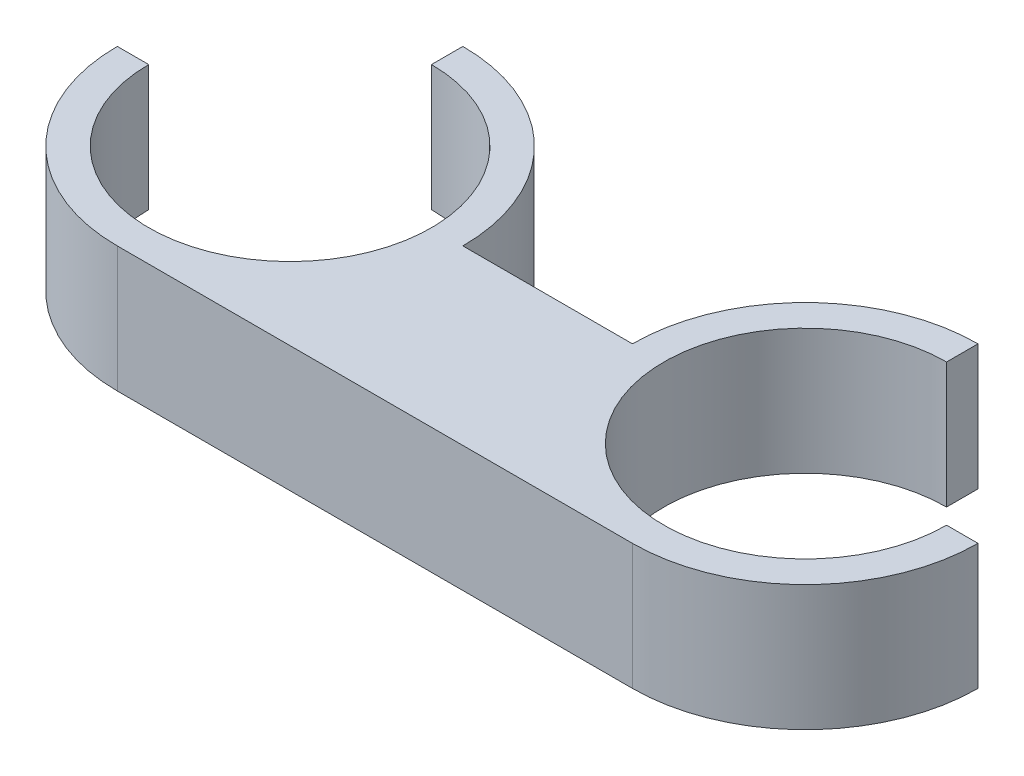
ISO-10303-21;
HEADER;
FILE_DESCRIPTION(('STEP AP214'),'2;1');
FILE_NAME('part.step','',(''),(''),'','','');
FILE_SCHEMA(('AUTOMOTIVE_DESIGN { 1 0 10303 214 1 1 1 1 }'));
ENDSEC;
DATA;
#1=APPLICATION_CONTEXT('core data for automotive mechanical design processes');
#2=APPLICATION_PROTOCOL_DEFINITION('international standard','automotive_design',2000,#1);
#3=PRODUCT_CONTEXT('',#1,'mechanical');
#4=PRODUCT('Part','Part','',(#3));
#5=PRODUCT_RELATED_PRODUCT_CATEGORY('part','',(#4));
#6=PRODUCT_DEFINITION_FORMATION('','',#4);
#7=PRODUCT_DEFINITION_CONTEXT('part definition',#1,'design');
#8=PRODUCT_DEFINITION('design','',#6,#7);
#9=PRODUCT_DEFINITION_SHAPE('','',#8);
#10=(LENGTH_UNIT() NAMED_UNIT(*) SI_UNIT(.MILLI.,.METRE.));
#11=(NAMED_UNIT(*) PLANE_ANGLE_UNIT() SI_UNIT($,.RADIAN.));
#12=(NAMED_UNIT(*) SI_UNIT($,.STERADIAN.) SOLID_ANGLE_UNIT());
#13=UNCERTAINTY_MEASURE_WITH_UNIT(LENGTH_MEASURE(1.E-05),#10,'distance_accuracy_value','');
#14=(GEOMETRIC_REPRESENTATION_CONTEXT(3) GLOBAL_UNCERTAINTY_ASSIGNED_CONTEXT((#13)) GLOBAL_UNIT_ASSIGNED_CONTEXT((#10,
#11,#12)) REPRESENTATION_CONTEXT('',''));
#15=CARTESIAN_POINT('',(0.,0.,0.));
#16=DIRECTION('',(0.,0.,1.));
#17=DIRECTION('',(1.,0.,0.));
#18=AXIS2_PLACEMENT_3D('',#15,#16,#17);
#19=CARTESIAN_POINT('',(-32.7952041244696,8.,0.));
#20=DIRECTION('',(0.,-1.,0.));
#21=DIRECTION('',(0.,0.,-1.));
#22=AXIS2_PLACEMENT_3D('',#19,#20,#21);
#23=CYLINDRICAL_SURFACE('',#22,11.);
#24=CARTESIAN_POINT('',(-32.7952041244696,0.,0.));
#25=DIRECTION('',(0.,1.,0.));
#26=DIRECTION('',(0.,0.,1.));
#27=AXIS2_PLACEMENT_3D('',#24,#25,#26);
#28=CIRCLE('',#27,11.);
#29=CARTESIAN_POINT('',(-43.7952041244696,0.,0.));
#30=VERTEX_POINT('',#29);
#31=CARTESIAN_POINT('',(-32.7952041244695,0.,11.));
#32=VERTEX_POINT('',#31);
#33=EDGE_CURVE('E159',#30,#32,#28,.T.);
#34=ORIENTED_EDGE('',*,*,#33,.T.);
#35=DIRECTION('',(0.,-1.,0.));
#36=VECTOR('',#35,1.);
#37=CARTESIAN_POINT('',(-32.7952041244695,8.,11.));
#38=LINE('',#37,#36);
#39=CARTESIAN_POINT('',(-32.7952041244695,8.,11.));
#40=VERTEX_POINT('',#39);
#41=EDGE_CURVE('E11',#40,#32,#38,.T.);
#42=ORIENTED_EDGE('',*,*,#41,.F.);
#43=CARTESIAN_POINT('',(-32.7952041244696,8.,0.));
#44=DIRECTION('',(0.,1.,0.));
#45=DIRECTION('',(0.,0.,1.));
#46=AXIS2_PLACEMENT_3D('',#43,#44,#45);
#47=CIRCLE('',#46,11.);
#48=CARTESIAN_POINT('',(-43.7952041244696,8.,0.));
#49=VERTEX_POINT('',#48);
#50=EDGE_CURVE('E185',#49,#40,#47,.T.);
#51=ORIENTED_EDGE('',*,*,#50,.F.);
#52=DIRECTION('',(0.,-1.,0.));
#53=VECTOR('',#52,1.);
#54=CARTESIAN_POINT('',(-43.7952041244696,8.,0.));
#55=LINE('',#54,#53);
#56=EDGE_CURVE('E155',#49,#30,#55,.T.);
#57=ORIENTED_EDGE('',*,*,#56,.T.);
#58=EDGE_LOOP('',(#34,#42,#51,#57));
#59=FACE_BOUND('',#58,.T.);
#60=ADVANCED_FACE('F39',(#59),#23,.T.);
#61=CARTESIAN_POINT('',(0.,8.,11.));
#62=DIRECTION('',(0.,0.,-1.));
#63=DIRECTION('',(-1.,0.,0.));
#64=AXIS2_PLACEMENT_3D('',#61,#62,#63);
#65=PLANE('',#64);
#66=DIRECTION('',(1.,0.,0.));
#67=VECTOR('',#66,1.);
#68=CARTESIAN_POINT('',(0.,0.,11.));
#69=LINE('',#68,#67);
#70=CARTESIAN_POINT('',(0.,0.,11.));
#71=VERTEX_POINT('',#70);
#72=EDGE_CURVE('E162',#32,#71,#69,.T.);
#73=ORIENTED_EDGE('',*,*,#72,.T.);
#74=DIRECTION('',(0.,-1.,0.));
#75=VECTOR('',#74,1.);
#76=CARTESIAN_POINT('',(0.,8.,11.));
#77=LINE('',#76,#75);
#78=CARTESIAN_POINT('',(0.,8.,11.));
#79=VERTEX_POINT('',#78);
#80=EDGE_CURVE('E48',#79,#71,#77,.T.);
#81=ORIENTED_EDGE('',*,*,#80,.F.);
#82=DIRECTION('',(1.,0.,0.));
#83=VECTOR('',#82,1.);
#84=CARTESIAN_POINT('',(0.,8.,11.));
#85=LINE('',#84,#83);
#86=EDGE_CURVE('E107',#40,#79,#85,.T.);
#87=ORIENTED_EDGE('',*,*,#86,.F.);
#88=ORIENTED_EDGE('',*,*,#41,.T.);
#89=EDGE_LOOP('',(#73,#81,#87,#88));
#90=FACE_BOUND('',#89,.T.);
#91=ADVANCED_FACE('F41',(#90),#65,.F.);
#92=CARTESIAN_POINT('',(0.,8.,0.));
#93=DIRECTION('',(0.,-1.,0.));
#94=DIRECTION('',(0.,0.,-1.));
#95=AXIS2_PLACEMENT_3D('',#92,#93,#94);
#96=CYLINDRICAL_SURFACE('',#95,11.);
#97=CARTESIAN_POINT('',(0.,0.,0.));
#98=DIRECTION('',(0.,1.,0.));
#99=DIRECTION('',(0.,0.,1.));
#100=AXIS2_PLACEMENT_3D('',#97,#98,#99);
#101=CIRCLE('',#100,11.);
#102=CARTESIAN_POINT('',(11.,0.,0.));
#103=VERTEX_POINT('',#102);
#104=EDGE_CURVE('E166',#103,#71,#101,.F.);
#105=ORIENTED_EDGE('',*,*,#104,.F.);
#106=DIRECTION('',(0.,-1.,0.));
#107=VECTOR('',#106,1.);
#108=CARTESIAN_POINT('',(11.,8.,0.));
#109=LINE('',#108,#107);
#110=CARTESIAN_POINT('',(11.,8.,0.));
#111=VERTEX_POINT('',#110);
#112=EDGE_CURVE('E200',#111,#103,#109,.T.);
#113=ORIENTED_EDGE('',*,*,#112,.F.);
#114=CARTESIAN_POINT('',(0.,8.,0.));
#115=DIRECTION('',(0.,1.,0.));
#116=DIRECTION('',(0.,0.,1.));
#117=AXIS2_PLACEMENT_3D('',#114,#115,#116);
#118=CIRCLE('',#117,11.);
#119=EDGE_CURVE('E206',#111,#79,#118,.F.);
#120=ORIENTED_EDGE('',*,*,#119,.T.);
#121=ORIENTED_EDGE('',*,*,#80,.T.);
#122=EDGE_LOOP('',(#105,#113,#120,#121));
#123=FACE_BOUND('',#122,.T.);
#124=ADVANCED_FACE('F204',(#123),#96,.T.);
#125=CARTESIAN_POINT('',(0.,8.,0.));
#126=DIRECTION('',(0.,0.,-1.));
#127=DIRECTION('',(-1.,0.,0.));
#128=AXIS2_PLACEMENT_3D('',#125,#126,#127);
#129=PLANE('',#128);
#130=DIRECTION('',(1.,0.,0.));
#131=VECTOR('',#130,1.);
#132=CARTESIAN_POINT('',(0.,0.,0.));
#133=LINE('',#132,#131);
#134=CARTESIAN_POINT('',(9.,0.,0.));
#135=VERTEX_POINT('',#134);
#136=EDGE_CURVE('E169',#135,#103,#133,.T.);
#137=ORIENTED_EDGE('',*,*,#136,.F.);
#138=DIRECTION('',(0.,-1.,0.));
#139=VECTOR('',#138,1.);
#140=CARTESIAN_POINT('',(9.,8.,0.));
#141=LINE('',#140,#139);
#142=CARTESIAN_POINT('',(9.,8.,0.));
#143=VERTEX_POINT('',#142);
#144=EDGE_CURVE('E198',#143,#135,#141,.T.);
#145=ORIENTED_EDGE('',*,*,#144,.F.);
#146=DIRECTION('',(1.,0.,0.));
#147=VECTOR('',#146,1.);
#148=CARTESIAN_POINT('',(0.,8.,0.));
#149=LINE('',#148,#147);
#150=EDGE_CURVE('E218',#143,#111,#149,.T.);
#151=ORIENTED_EDGE('',*,*,#150,.T.);
#152=ORIENTED_EDGE('',*,*,#112,.T.);
#153=EDGE_LOOP('',(#137,#145,#151,#152));
#154=FACE_BOUND('',#153,.T.);
#155=ADVANCED_FACE('F214',(#154),#129,.T.);
#156=CARTESIAN_POINT('',(0.,8.,0.));
#157=DIRECTION('',(0.,-1.,0.));
#158=DIRECTION('',(0.,0.,-1.));
#159=AXIS2_PLACEMENT_3D('',#156,#157,#158);
#160=CYLINDRICAL_SURFACE('',#159,9.);
#161=CARTESIAN_POINT('',(0.,0.,0.));
#162=DIRECTION('',(0.,1.,0.));
#163=DIRECTION('',(0.,0.,1.));
#164=AXIS2_PLACEMENT_3D('',#161,#162,#163);
#165=CIRCLE('',#164,9.);
#166=CARTESIAN_POINT('',(0.,0.,-9.));
#167=VERTEX_POINT('',#166);
#168=EDGE_CURVE('E173',#135,#167,#165,.F.);
#169=ORIENTED_EDGE('',*,*,#168,.T.);
#170=DIRECTION('',(0.,-1.,0.));
#171=VECTOR('',#170,1.);
#172=CARTESIAN_POINT('',(0.,8.,-9.));
#173=LINE('',#172,#171);
#174=CARTESIAN_POINT('',(0.,8.,-9.));
#175=VERTEX_POINT('',#174);
#176=EDGE_CURVE('E196',#175,#167,#173,.T.);
#177=ORIENTED_EDGE('',*,*,#176,.F.);
#178=CARTESIAN_POINT('',(0.,8.,0.));
#179=DIRECTION('',(0.,1.,0.));
#180=DIRECTION('',(0.,0.,1.));
#181=AXIS2_PLACEMENT_3D('',#178,#179,#180);
#182=CIRCLE('',#181,9.);
#183=EDGE_CURVE('E221',#143,#175,#182,.F.);
#184=ORIENTED_EDGE('',*,*,#183,.F.);
#185=ORIENTED_EDGE('',*,*,#144,.T.);
#186=EDGE_LOOP('',(#169,#177,#184,#185));
#187=FACE_BOUND('',#186,.T.);
#188=ADVANCED_FACE('F236',(#187),#160,.F.);
#189=CARTESIAN_POINT('',(0.,8.,0.));
#190=DIRECTION('',(1.,0.,0.));
#191=DIRECTION('',(0.,0.,-1.));
#192=AXIS2_PLACEMENT_3D('',#189,#190,#191);
#193=PLANE('',#192);
#194=DIRECTION('',(0.,0.,1.));
#195=VECTOR('',#194,1.);
#196=CARTESIAN_POINT('',(0.,0.,0.));
#197=LINE('',#196,#195);
#198=CARTESIAN_POINT('',(0.,0.,-11.));
#199=VERTEX_POINT('',#198);
#200=EDGE_CURVE('E176',#199,#167,#197,.T.);
#201=ORIENTED_EDGE('',*,*,#200,.F.);
#202=DIRECTION('',(0.,-1.,0.));
#203=VECTOR('',#202,1.);
#204=CARTESIAN_POINT('',(0.,8.,-11.));
#205=LINE('',#204,#203);
#206=CARTESIAN_POINT('',(0.,8.,-11.));
#207=VERTEX_POINT('',#206);
#208=EDGE_CURVE('E194',#207,#199,#205,.T.);
#209=ORIENTED_EDGE('',*,*,#208,.F.);
#210=DIRECTION('',(0.,0.,1.));
#211=VECTOR('',#210,1.);
#212=CARTESIAN_POINT('',(0.,8.,0.));
#213=LINE('',#212,#211);
#214=EDGE_CURVE('E226',#207,#175,#213,.T.);
#215=ORIENTED_EDGE('',*,*,#214,.T.);
#216=ORIENTED_EDGE('',*,*,#176,.T.);
#217=EDGE_LOOP('',(#201,#209,#215,#216));
#218=FACE_BOUND('',#217,.T.);
#219=ADVANCED_FACE('F238',(#218),#193,.T.);
#220=CARTESIAN_POINT('',(-11.,0.,0.));
#221=VERTEX_POINT('',#220);
#222=EDGE_CURVE('E170',#221,#199,#101,.F.);
#223=ORIENTED_EDGE('',*,*,#222,.F.);
#224=DIRECTION('',(0.,-1.,0.));
#225=VECTOR('',#224,1.);
#226=CARTESIAN_POINT('',(-11.,8.,0.));
#227=LINE('',#226,#225);
#228=CARTESIAN_POINT('',(-11.,8.,0.));
#229=VERTEX_POINT('',#228);
#230=EDGE_CURVE('E192',#229,#221,#227,.T.);
#231=ORIENTED_EDGE('',*,*,#230,.F.);
#232=EDGE_CURVE('E220',#229,#207,#118,.F.);
#233=ORIENTED_EDGE('',*,*,#232,.T.);
#234=ORIENTED_EDGE('',*,*,#208,.T.);
#235=EDGE_LOOP('',(#223,#231,#233,#234));
#236=FACE_BOUND('',#235,.T.);
#237=ADVANCED_FACE('F243',(#236),#96,.T.);
#238=CARTESIAN_POINT('',(0.,8.,0.));
#239=DIRECTION('',(0.,0.,1.));
#240=DIRECTION('',(1.,0.,0.));
#241=AXIS2_PLACEMENT_3D('',#238,#239,#240);
#242=PLANE('',#241);
#243=DIRECTION('',(-1.,0.,0.));
#244=VECTOR('',#243,1.);
#245=CARTESIAN_POINT('',(0.,0.,0.));
#246=LINE('',#245,#244);
#247=CARTESIAN_POINT('',(-21.7952041244696,0.,0.));
#248=VERTEX_POINT('',#247);
#249=EDGE_CURVE('E179',#221,#248,#246,.T.);
#250=ORIENTED_EDGE('',*,*,#249,.T.);
#251=DIRECTION('',(0.,-1.,0.));
#252=VECTOR('',#251,1.);
#253=CARTESIAN_POINT('',(-21.7952041244696,8.,0.));
#254=LINE('',#253,#252);
#255=CARTESIAN_POINT('',(-21.7952041244696,8.,0.));
#256=VERTEX_POINT('',#255);
#257=EDGE_CURVE('E189',#256,#248,#254,.T.);
#258=ORIENTED_EDGE('',*,*,#257,.F.);
#259=DIRECTION('',(-1.,0.,0.));
#260=VECTOR('',#259,1.);
#261=CARTESIAN_POINT('',(0.,8.,0.));
#262=LINE('',#261,#260);
#263=EDGE_CURVE('E225',#229,#256,#262,.T.);
#264=ORIENTED_EDGE('',*,*,#263,.F.);
#265=ORIENTED_EDGE('',*,*,#230,.T.);
#266=EDGE_LOOP('',(#250,#258,#264,#265));
#267=FACE_BOUND('',#266,.T.);
#268=ADVANCED_FACE('F247',(#267),#242,.F.);
#269=CARTESIAN_POINT('',(-32.7952041244696,0.,-11.));
#270=VERTEX_POINT('',#269);
#271=EDGE_CURVE('E163',#248,#270,#28,.T.);
#272=ORIENTED_EDGE('',*,*,#271,.T.);
#273=DIRECTION('',(0.,-1.,0.));
#274=VECTOR('',#273,1.);
#275=CARTESIAN_POINT('',(-32.7952041244696,8.,-11.));
#276=LINE('',#275,#274);
#277=CARTESIAN_POINT('',(-32.7952041244696,8.,-11.));
#278=VERTEX_POINT('',#277);
#279=EDGE_CURVE('E151',#278,#270,#276,.T.);
#280=ORIENTED_EDGE('',*,*,#279,.F.);
#281=EDGE_CURVE('E138',#256,#278,#47,.T.);
#282=ORIENTED_EDGE('',*,*,#281,.F.);
#283=ORIENTED_EDGE('',*,*,#257,.T.);
#284=EDGE_LOOP('',(#272,#280,#282,#283));
#285=FACE_BOUND('',#284,.T.);
#286=ADVANCED_FACE('F249',(#285),#23,.T.);
#287=CARTESIAN_POINT('',(-32.7952041244696,8.,0.));
#288=DIRECTION('',(1.,0.,0.));
#289=DIRECTION('',(0.,0.,-1.));
#290=AXIS2_PLACEMENT_3D('',#287,#288,#289);
#291=PLANE('',#290);
#292=DIRECTION('',(0.,0.,1.));
#293=VECTOR('',#292,1.);
#294=CARTESIAN_POINT('',(-32.7952041244696,0.,0.));
#295=LINE('',#294,#293);
#296=CARTESIAN_POINT('',(-32.7952041244696,0.,-9.));
#297=VERTEX_POINT('',#296);
#298=EDGE_CURVE('E147',#270,#297,#295,.T.);
#299=ORIENTED_EDGE('',*,*,#298,.T.);
#300=DIRECTION('',(0.,-1.,0.));
#301=VECTOR('',#300,1.);
#302=CARTESIAN_POINT('',(-32.7952041244696,8.,-9.));
#303=LINE('',#302,#301);
#304=CARTESIAN_POINT('',(-32.7952041244696,8.,-9.));
#305=VERTEX_POINT('',#304);
#306=EDGE_CURVE('E144',#305,#297,#303,.T.);
#307=ORIENTED_EDGE('',*,*,#306,.F.);
#308=DIRECTION('',(0.,0.,1.));
#309=VECTOR('',#308,1.);
#310=CARTESIAN_POINT('',(-32.7952041244696,8.,0.));
#311=LINE('',#310,#309);
#312=EDGE_CURVE('E132',#278,#305,#311,.T.);
#313=ORIENTED_EDGE('',*,*,#312,.F.);
#314=ORIENTED_EDGE('',*,*,#279,.T.);
#315=EDGE_LOOP('',(#299,#307,#313,#314));
#316=FACE_BOUND('',#315,.T.);
#317=ADVANCED_FACE('F145',(#316),#291,.F.);
#318=CARTESIAN_POINT('',(-32.7952041244696,8.,0.));
#319=DIRECTION('',(0.,-1.,0.));
#320=DIRECTION('',(0.,0.,-1.));
#321=AXIS2_PLACEMENT_3D('',#318,#319,#320);
#322=CYLINDRICAL_SURFACE('',#321,9.);
#323=CARTESIAN_POINT('',(-32.7952041244696,0.,0.));
#324=DIRECTION('',(0.,1.,0.));
#325=DIRECTION('',(0.,0.,1.));
#326=AXIS2_PLACEMENT_3D('',#323,#324,#325);
#327=CIRCLE('',#326,9.);
#328=CARTESIAN_POINT('',(-41.7952041244696,0.,0.));
#329=VERTEX_POINT('',#328);
#330=EDGE_CURVE('E182',#329,#297,#327,.T.);
#331=ORIENTED_EDGE('',*,*,#330,.F.);
#332=DIRECTION('',(0.,-1.,0.));
#333=VECTOR('',#332,1.);
#334=CARTESIAN_POINT('',(-41.7952041244696,8.,0.));
#335=LINE('',#334,#333);
#336=CARTESIAN_POINT('',(-41.7952041244696,8.,0.));
#337=VERTEX_POINT('',#336);
#338=EDGE_CURVE('E96',#337,#329,#335,.T.);
#339=ORIENTED_EDGE('',*,*,#338,.F.);
#340=CARTESIAN_POINT('',(-32.7952041244696,8.,0.));
#341=DIRECTION('',(0.,1.,0.));
#342=DIRECTION('',(0.,0.,1.));
#343=AXIS2_PLACEMENT_3D('',#340,#341,#342);
#344=CIRCLE('',#343,9.);
#345=EDGE_CURVE('E136',#337,#305,#344,.T.);
#346=ORIENTED_EDGE('',*,*,#345,.T.);
#347=ORIENTED_EDGE('',*,*,#306,.T.);
#348=EDGE_LOOP('',(#331,#339,#346,#347));
#349=FACE_BOUND('',#348,.T.);
#350=ADVANCED_FACE('F153',(#349),#322,.F.);
#351=CARTESIAN_POINT('',(0.,8.,0.));
#352=DIRECTION('',(0.,0.,1.));
#353=DIRECTION('',(1.,0.,0.));
#354=AXIS2_PLACEMENT_3D('',#351,#352,#353);
#355=PLANE('',#354);
#356=DIRECTION('',(-1.,0.,0.));
#357=VECTOR('',#356,1.);
#358=CARTESIAN_POINT('',(0.,0.,0.));
#359=LINE('',#358,#357);
#360=EDGE_CURVE('E99',#329,#30,#359,.T.);
#361=ORIENTED_EDGE('',*,*,#360,.T.);
#362=ORIENTED_EDGE('',*,*,#56,.F.);
#363=DIRECTION('',(-1.,0.,0.));
#364=VECTOR('',#363,1.);
#365=CARTESIAN_POINT('',(0.,8.,0.));
#366=LINE('',#365,#364);
#367=EDGE_CURVE('E56',#337,#49,#366,.T.);
#368=ORIENTED_EDGE('',*,*,#367,.F.);
#369=ORIENTED_EDGE('',*,*,#338,.T.);
#370=EDGE_LOOP('',(#361,#362,#368,#369));
#371=FACE_BOUND('',#370,.T.);
#372=ADVANCED_FACE('F253',(#371),#355,.F.);
#373=CARTESIAN_POINT('',(0.,8.,0.));
#374=DIRECTION('',(0.,1.,0.));
#375=DIRECTION('',(0.,0.,1.));
#376=AXIS2_PLACEMENT_3D('',#373,#374,#375);
#377=PLANE('',#376);
#378=ORIENTED_EDGE('',*,*,#50,.T.);
#379=ORIENTED_EDGE('',*,*,#86,.T.);
#380=ORIENTED_EDGE('',*,*,#119,.F.);
#381=ORIENTED_EDGE('',*,*,#150,.F.);
#382=ORIENTED_EDGE('',*,*,#183,.T.);
#383=ORIENTED_EDGE('',*,*,#214,.F.);
#384=ORIENTED_EDGE('',*,*,#232,.F.);
#385=ORIENTED_EDGE('',*,*,#263,.T.);
#386=ORIENTED_EDGE('',*,*,#281,.T.);
#387=ORIENTED_EDGE('',*,*,#312,.T.);
#388=ORIENTED_EDGE('',*,*,#345,.F.);
#389=ORIENTED_EDGE('',*,*,#367,.T.);
#390=EDGE_LOOP('',(#378,#379,#380,#381,#382,#383,#384,#385,#386,#387,#388,#389));
#391=FACE_BOUND('',#390,.T.);
#392=ADVANCED_FACE('F134',(#391),#377,.T.);
#393=CARTESIAN_POINT('',(0.,0.,0.));
#394=DIRECTION('',(0.,1.,0.));
#395=DIRECTION('',(0.,0.,1.));
#396=AXIS2_PLACEMENT_3D('',#393,#394,#395);
#397=PLANE('',#396);
#398=ORIENTED_EDGE('',*,*,#33,.F.);
#399=ORIENTED_EDGE('',*,*,#360,.F.);
#400=ORIENTED_EDGE('',*,*,#330,.T.);
#401=ORIENTED_EDGE('',*,*,#298,.F.);
#402=ORIENTED_EDGE('',*,*,#271,.F.);
#403=ORIENTED_EDGE('',*,*,#249,.F.);
#404=ORIENTED_EDGE('',*,*,#222,.T.);
#405=ORIENTED_EDGE('',*,*,#200,.T.);
#406=ORIENTED_EDGE('',*,*,#168,.F.);
#407=ORIENTED_EDGE('',*,*,#136,.T.);
#408=ORIENTED_EDGE('',*,*,#104,.T.);
#409=ORIENTED_EDGE('',*,*,#72,.F.);
#410=EDGE_LOOP('',(#398,#399,#400,#401,#402,#403,#404,#405,#406,#407,#408,#409));
#411=FACE_BOUND('',#410,.T.);
#412=ADVANCED_FACE('F210',(#411),#397,.F.);
#413=CLOSED_SHELL('',(#60,#91,#124,#155,#188,#219,#237,#268,#286,#317,#350,#372,#392,#412));
#414=MANIFOLD_SOLID_BREP('B2',#413);
#415=ADVANCED_BREP_SHAPE_REPRESENTATION('',(#18,#414),#14);
#416=SHAPE_DEFINITION_REPRESENTATION(#9,#415);
ENDSEC;
END-ISO-10303-21;
